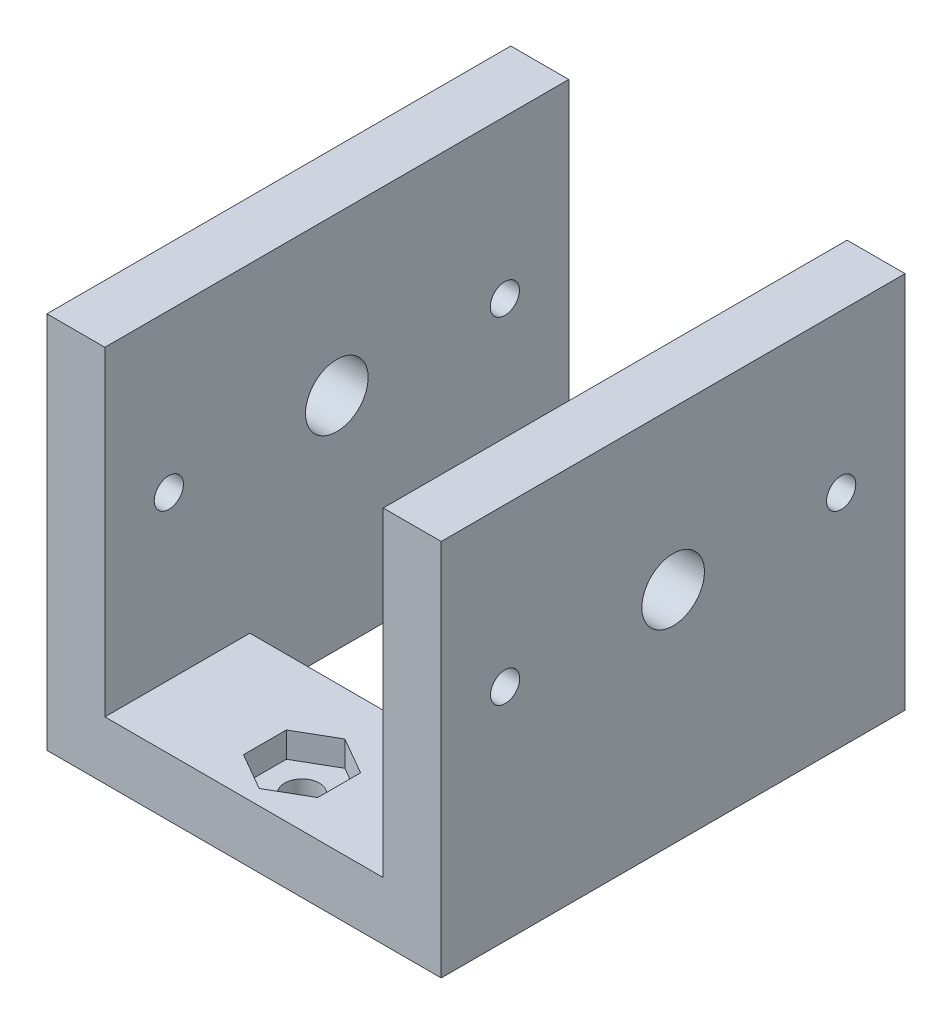
ISO-10303-21;
HEADER;
FILE_DESCRIPTION(('STEP AP214'),'2;1');
FILE_NAME('part.step','',(''),(''),'','','');
FILE_SCHEMA(('AUTOMOTIVE_DESIGN { 1 0 10303 214 1 1 1 1 }'));
ENDSEC;
DATA;
#1=APPLICATION_CONTEXT('core data for automotive mechanical design processes');
#2=APPLICATION_PROTOCOL_DEFINITION('international standard','automotive_design',2000,#1);
#3=PRODUCT_CONTEXT('',#1,'mechanical');
#4=PRODUCT('Part','Part','',(#3));
#5=PRODUCT_RELATED_PRODUCT_CATEGORY('part','',(#4));
#6=PRODUCT_DEFINITION_FORMATION('','',#4);
#7=PRODUCT_DEFINITION_CONTEXT('part definition',#1,'design');
#8=PRODUCT_DEFINITION('design','',#6,#7);
#9=PRODUCT_DEFINITION_SHAPE('','',#8);
#10=(LENGTH_UNIT() NAMED_UNIT(*) SI_UNIT(.MILLI.,.METRE.));
#11=(NAMED_UNIT(*) PLANE_ANGLE_UNIT() SI_UNIT($,.RADIAN.));
#12=(NAMED_UNIT(*) SI_UNIT($,.STERADIAN.) SOLID_ANGLE_UNIT());
#13=UNCERTAINTY_MEASURE_WITH_UNIT(LENGTH_MEASURE(1.E-05),#10,'distance_accuracy_value','');
#14=(GEOMETRIC_REPRESENTATION_CONTEXT(3) GLOBAL_UNCERTAINTY_ASSIGNED_CONTEXT((#13)) GLOBAL_UNIT_ASSIGNED_CONTEXT((#10,
#11,#12)) REPRESENTATION_CONTEXT('',''));
#15=CARTESIAN_POINT('',(0.,0.,0.));
#16=DIRECTION('',(0.,0.,1.));
#17=DIRECTION('',(1.,0.,0.));
#18=AXIS2_PLACEMENT_3D('',#15,#16,#17);
#19=CARTESIAN_POINT('',(-15.24,4.6822316367925,-12.7));
#20=DIRECTION('',(0.,-1.,0.));
#21=DIRECTION('',(0.,0.,-1.));
#22=AXIS2_PLACEMENT_3D('',#19,#20,#21);
#23=PLANE('',#22);
#24=DIRECTION('',(0.,0.,1.));
#25=VECTOR('',#24,1.);
#26=CARTESIAN_POINT('',(15.24,4.6822316367925,-12.7));
#27=LINE('',#26,#25);
#28=CARTESIAN_POINT('',(15.24,4.68223163679251,9.525));
#29=VERTEX_POINT('',#28);
#30=CARTESIAN_POINT('',(15.24,4.6822316367925,25.4));
#31=VERTEX_POINT('',#30);
#32=EDGE_CURVE('E317',#29,#31,#27,.T.);
#33=ORIENTED_EDGE('',*,*,#32,.F.);
#34=DIRECTION('',(-1.,0.,0.));
#35=VECTOR('',#34,1.);
#36=CARTESIAN_POINT('',(-15.24,4.6822316367925,9.525));
#37=LINE('',#36,#35);
#38=CARTESIAN_POINT('',(-15.24,4.6822316367925,9.525));
#39=VERTEX_POINT('',#38);
#40=EDGE_CURVE('E226',#29,#39,#37,.T.);
#41=ORIENTED_EDGE('',*,*,#40,.T.);
#42=DIRECTION('',(0.,0.,1.));
#43=VECTOR('',#42,1.);
#44=CARTESIAN_POINT('',(-15.24,4.6822316367925,-12.7));
#45=LINE('',#44,#43);
#46=CARTESIAN_POINT('',(-15.24,4.6822316367925,25.4));
#47=VERTEX_POINT('',#46);
#48=EDGE_CURVE('E322',#39,#47,#45,.T.);
#49=ORIENTED_EDGE('',*,*,#48,.T.);
#50=DIRECTION('',(-1.,0.,0.));
#51=VECTOR('',#50,1.);
#52=CARTESIAN_POINT('',(15.24,4.6822316367925,25.4));
#53=LINE('',#52,#51);
#54=EDGE_CURVE('E305',#31,#47,#53,.T.);
#55=ORIENTED_EDGE('',*,*,#54,.F.);
#56=EDGE_LOOP('',(#33,#41,#49,#55));
#57=FACE_BOUND('',#56,.T.);
#58=DIRECTION('',(0.,0.,1.));
#59=VECTOR('',#58,1.);
#60=CARTESIAN_POINT('',(4.064,4.6822316367925,16.7036485060134));
#61=LINE('',#60,#59);
#62=CARTESIAN_POINT('',(4.064,4.6822316367925,16.7036485060134));
#63=VERTEX_POINT('',#62);
#64=CARTESIAN_POINT('',(4.064,4.6822316367925,21.3963514939866));
#65=VERTEX_POINT('',#64);
#66=EDGE_CURVE('E65',#63,#65,#61,.T.);
#67=ORIENTED_EDGE('',*,*,#66,.T.);
#68=DIRECTION('',(-0.866025403784438,0.,0.5));
#69=VECTOR('',#68,1.);
#70=CARTESIAN_POINT('',(4.064,4.6822316367925,21.3963514939866));
#71=LINE('',#70,#69);
#72=CARTESIAN_POINT('',(0.,4.6822316367925,23.7427029879733));
#73=VERTEX_POINT('',#72);
#74=EDGE_CURVE('E400',#65,#73,#71,.T.);
#75=ORIENTED_EDGE('',*,*,#74,.T.);
#76=DIRECTION('',(-0.866025403784438,0.,-0.5));
#77=VECTOR('',#76,1.);
#78=CARTESIAN_POINT('',(0.,4.6822316367925,23.7427029879733));
#79=LINE('',#78,#77);
#80=CARTESIAN_POINT('',(-4.064,4.6822316367925,21.3963514939866));
#81=VERTEX_POINT('',#80);
#82=EDGE_CURVE('E424',#73,#81,#79,.T.);
#83=ORIENTED_EDGE('',*,*,#82,.T.);
#84=DIRECTION('',(0.,0.,-1.));
#85=VECTOR('',#84,1.);
#86=CARTESIAN_POINT('',(-4.064,4.6822316367925,21.3963514939866));
#87=LINE('',#86,#85);
#88=CARTESIAN_POINT('',(-4.064,4.6822316367925,16.7036485060134));
#89=VERTEX_POINT('',#88);
#90=EDGE_CURVE('E420',#81,#89,#87,.T.);
#91=ORIENTED_EDGE('',*,*,#90,.T.);
#92=DIRECTION('',(0.866025403784438,0.,-0.5));
#93=VECTOR('',#92,1.);
#94=CARTESIAN_POINT('',(-4.064,4.6822316367925,16.7036485060134));
#95=LINE('',#94,#93);
#96=CARTESIAN_POINT('',(0.,4.6822316367925,14.3572970120267));
#97=VERTEX_POINT('',#96);
#98=EDGE_CURVE('E409',#89,#97,#95,.T.);
#99=ORIENTED_EDGE('',*,*,#98,.T.);
#100=DIRECTION('',(0.866025403784438,0.,0.5));
#101=VECTOR('',#100,1.);
#102=CARTESIAN_POINT('',(0.,4.6822316367925,14.3572970120267));
#103=LINE('',#102,#101);
#104=EDGE_CURVE('E403',#97,#63,#103,.T.);
#105=ORIENTED_EDGE('',*,*,#104,.T.);
#106=EDGE_LOOP('',(#67,#75,#83,#91,#99,#105));
#107=FACE_BOUND('',#106,.T.);
#108=ADVANCED_FACE('F39',(#57,#107),#23,.F.);
#109=DIRECTION('',(-0.866025403784438,0.,-0.5));
#110=VECTOR('',#109,1.);
#111=CARTESIAN_POINT('',(4.064,4.6822316367925,-21.3963514939866));
#112=LINE('',#111,#110);
#113=CARTESIAN_POINT('',(4.064,4.6822316367925,-21.3963514939866));
#114=VERTEX_POINT('',#113);
#115=CARTESIAN_POINT('',(0.,4.6822316367925,-23.7427029879733));
#116=VERTEX_POINT('',#115);
#117=EDGE_CURVE('E477',#114,#116,#112,.T.);
#118=ORIENTED_EDGE('',*,*,#117,.F.);
#119=DIRECTION('',(0.,0.,-1.));
#120=VECTOR('',#119,1.);
#121=CARTESIAN_POINT('',(4.064,4.6822316367925,-16.7036485060134));
#122=LINE('',#121,#120);
#123=CARTESIAN_POINT('',(4.064,4.6822316367925,-16.7036485060134));
#124=VERTEX_POINT('',#123);
#125=EDGE_CURVE('E433',#124,#114,#122,.T.);
#126=ORIENTED_EDGE('',*,*,#125,.F.);
#127=DIRECTION('',(0.866025403784438,0.,-0.5));
#128=VECTOR('',#127,1.);
#129=CARTESIAN_POINT('',(0.,4.6822316367925,-14.3572970120267));
#130=LINE('',#129,#128);
#131=CARTESIAN_POINT('',(0.,4.6822316367925,-14.3572970120267));
#132=VERTEX_POINT('',#131);
#133=EDGE_CURVE('E454',#132,#124,#130,.T.);
#134=ORIENTED_EDGE('',*,*,#133,.F.);
#135=DIRECTION('',(0.866025403784438,0.,0.5));
#136=VECTOR('',#135,1.);
#137=CARTESIAN_POINT('',(-4.064,4.6822316367925,-16.7036485060134));
#138=LINE('',#137,#136);
#139=CARTESIAN_POINT('',(-4.064,4.6822316367925,-16.7036485060134));
#140=VERTEX_POINT('',#139);
#141=EDGE_CURVE('E489',#140,#132,#138,.T.);
#142=ORIENTED_EDGE('',*,*,#141,.F.);
#143=DIRECTION('',(0.,0.,1.));
#144=VECTOR('',#143,1.);
#145=CARTESIAN_POINT('',(-4.064,4.6822316367925,-21.3963514939866));
#146=LINE('',#145,#144);
#147=CARTESIAN_POINT('',(-4.064,4.6822316367925,-21.3963514939866));
#148=VERTEX_POINT('',#147);
#149=EDGE_CURVE('E485',#148,#140,#146,.T.);
#150=ORIENTED_EDGE('',*,*,#149,.F.);
#151=DIRECTION('',(-0.866025403784438,0.,0.5));
#152=VECTOR('',#151,1.);
#153=CARTESIAN_POINT('',(0.,4.6822316367925,-23.7427029879733));
#154=LINE('',#153,#152);
#155=EDGE_CURVE('E481',#116,#148,#154,.T.);
#156=ORIENTED_EDGE('',*,*,#155,.F.);
#157=EDGE_LOOP('',(#118,#126,#134,#142,#150,#156));
#158=FACE_BOUND('',#157,.T.);
#159=CARTESIAN_POINT('',(-15.24,4.6822316367925,-25.4));
#160=VERTEX_POINT('',#159);
#161=CARTESIAN_POINT('',(-15.24,4.68223163679251,-9.525));
#162=VERTEX_POINT('',#161);
#163=EDGE_CURVE('E318',#160,#162,#45,.T.);
#164=ORIENTED_EDGE('',*,*,#163,.T.);
#165=DIRECTION('',(1.,0.,0.));
#166=VECTOR('',#165,1.);
#167=CARTESIAN_POINT('',(-15.24,4.6822316367925,-9.525));
#168=LINE('',#167,#166);
#169=CARTESIAN_POINT('',(15.24,4.68223163679251,-9.525));
#170=VERTEX_POINT('',#169);
#171=EDGE_CURVE('E242',#162,#170,#168,.T.);
#172=ORIENTED_EDGE('',*,*,#171,.T.);
#173=CARTESIAN_POINT('',(15.24,4.6822316367925,-25.4));
#174=VERTEX_POINT('',#173);
#175=EDGE_CURVE('E314',#174,#170,#27,.T.);
#176=ORIENTED_EDGE('',*,*,#175,.F.);
#177=DIRECTION('',(-1.,0.,0.));
#178=VECTOR('',#177,1.);
#179=CARTESIAN_POINT('',(15.24,4.6822316367925,-25.4));
#180=LINE('',#179,#178);
#181=EDGE_CURVE('E274',#174,#160,#180,.T.);
#182=ORIENTED_EDGE('',*,*,#181,.T.);
#183=EDGE_LOOP('',(#164,#172,#176,#182));
#184=FACE_BOUND('',#183,.T.);
#185=ADVANCED_FACE('F361',(#158,#184),#23,.F.);
#186=CARTESIAN_POINT('',(-26.9407683632074,39.7342316367925,-12.7));
#187=DIRECTION('',(0.,1.,0.));
#188=DIRECTION('',(0.,0.,1.));
#189=AXIS2_PLACEMENT_3D('',#186,#187,#188);
#190=PLANE('',#189);
#191=DIRECTION('',(-1.,0.,0.));
#192=VECTOR('',#191,1.);
#193=CARTESIAN_POINT('',(26.9407683632074,39.7342316367925,25.4));
#194=LINE('',#193,#192);
#195=CARTESIAN_POINT('',(21.59,39.7342316367925,25.4));
#196=VERTEX_POINT('',#195);
#197=CARTESIAN_POINT('',(15.24,39.7342316367925,25.4));
#198=VERTEX_POINT('',#197);
#199=EDGE_CURVE('E297',#196,#198,#194,.T.);
#200=ORIENTED_EDGE('',*,*,#199,.F.);
#201=DIRECTION('',(0.,0.,1.));
#202=VECTOR('',#201,1.);
#203=CARTESIAN_POINT('',(21.59,39.7342316367925,-25.4));
#204=LINE('',#203,#202);
#205=CARTESIAN_POINT('',(21.59,39.7342316367925,-25.4));
#206=VERTEX_POINT('',#205);
#207=EDGE_CURVE('E250',#206,#196,#204,.T.);
#208=ORIENTED_EDGE('',*,*,#207,.F.);
#209=DIRECTION('',(-1.,0.,0.));
#210=VECTOR('',#209,1.);
#211=CARTESIAN_POINT('',(26.9407683632074,39.7342316367925,-25.4));
#212=LINE('',#211,#210);
#213=CARTESIAN_POINT('',(15.24,39.7342316367925,-25.4));
#214=VERTEX_POINT('',#213);
#215=EDGE_CURVE('E282',#206,#214,#212,.T.);
#216=ORIENTED_EDGE('',*,*,#215,.T.);
#217=DIRECTION('',(0.,0.,1.));
#218=VECTOR('',#217,1.);
#219=CARTESIAN_POINT('',(15.24,39.7342316367925,-12.7));
#220=LINE('',#219,#218);
#221=EDGE_CURVE('E313',#214,#198,#220,.T.);
#222=ORIENTED_EDGE('',*,*,#221,.T.);
#223=EDGE_LOOP('',(#200,#208,#216,#222));
#224=FACE_BOUND('',#223,.T.);
#225=ADVANCED_FACE('F372',(#224),#190,.T.);
#226=CARTESIAN_POINT('',(0.,0.,25.4));
#227=DIRECTION('',(0.,0.,1.));
#228=DIRECTION('',(1.,0.,0.));
#229=AXIS2_PLACEMENT_3D('',#226,#227,#228);
#230=PLANE('',#229);
#231=DIRECTION('',(1.,0.,0.));
#232=VECTOR('',#231,1.);
#233=CARTESIAN_POINT('',(-26.9407683632074,-1.66776836320751,25.4));
#234=LINE('',#233,#232);
#235=CARTESIAN_POINT('',(-21.59,-1.66776836320751,25.4));
#236=VERTEX_POINT('',#235);
#237=CARTESIAN_POINT('',(21.59,-1.66776836320751,25.4));
#238=VERTEX_POINT('',#237);
#239=EDGE_CURVE('E293',#236,#238,#234,.T.);
#240=ORIENTED_EDGE('',*,*,#239,.T.);
#241=DIRECTION('',(0.,1.,0.));
#242=VECTOR('',#241,1.);
#243=CARTESIAN_POINT('',(21.59,39.7342316367925,25.4));
#244=LINE('',#243,#242);
#245=EDGE_CURVE('E246',#238,#196,#244,.T.);
#246=ORIENTED_EDGE('',*,*,#245,.T.);
#247=ORIENTED_EDGE('',*,*,#199,.T.);
#248=DIRECTION('',(0.,-1.,0.));
#249=VECTOR('',#248,1.);
#250=CARTESIAN_POINT('',(15.24,39.7342316367925,25.4));
#251=LINE('',#250,#249);
#252=EDGE_CURVE('E301',#198,#31,#251,.T.);
#253=ORIENTED_EDGE('',*,*,#252,.T.);
#254=ORIENTED_EDGE('',*,*,#54,.T.);
#255=DIRECTION('',(0.,1.,0.));
#256=VECTOR('',#255,1.);
#257=CARTESIAN_POINT('',(-15.24,4.6822316367925,25.4));
#258=LINE('',#257,#256);
#259=CARTESIAN_POINT('',(-15.24,39.7342316367925,25.4));
#260=VERTEX_POINT('',#259);
#261=EDGE_CURVE('E309',#47,#260,#258,.T.);
#262=ORIENTED_EDGE('',*,*,#261,.T.);
#263=DIRECTION('',(-1.,0.,0.));
#264=VECTOR('',#263,1.);
#265=CARTESIAN_POINT('',(-15.24,39.7342316367925,25.4));
#266=LINE('',#265,#264);
#267=CARTESIAN_POINT('',(-21.59,39.7342316367925,25.4));
#268=VERTEX_POINT('',#267);
#269=EDGE_CURVE('E289',#260,#268,#266,.T.);
#270=ORIENTED_EDGE('',*,*,#269,.T.);
#271=DIRECTION('',(0.,1.,0.));
#272=VECTOR('',#271,1.);
#273=CARTESIAN_POINT('',(-21.59,39.7342316367925,25.4));
#274=LINE('',#273,#272);
#275=EDGE_CURVE('E256',#236,#268,#274,.T.);
#276=ORIENTED_EDGE('',*,*,#275,.F.);
#277=EDGE_LOOP('',(#240,#246,#247,#253,#254,#262,#270,#276));
#278=FACE_BOUND('',#277,.T.);
#279=ADVANCED_FACE('F375',(#278),#230,.T.);
#280=CARTESIAN_POINT('',(-26.9407683632074,-1.66776836320751,-25.4));
#281=DIRECTION('',(0.,-1.,0.));
#282=DIRECTION('',(0.,0.,-1.));
#283=AXIS2_PLACEMENT_3D('',#280,#281,#282);
#284=PLANE('',#283);
#285=CARTESIAN_POINT('',(0.,-1.66776836320751,-19.05));
#286=DIRECTION('',(0.,-1.,0.));
#287=DIRECTION('',(0.,0.,-1.));
#288=AXIS2_PLACEMENT_3D('',#285,#286,#287);
#289=CIRCLE('',#288,1.89864999999999);
#290=CARTESIAN_POINT('',(0.,-1.66776836320751,-20.94865));
#291=VERTEX_POINT('',#290);
#292=EDGE_CURVE('E405',#291,#291,#289,.T.);
#293=ORIENTED_EDGE('',*,*,#292,.F.);
#294=EDGE_LOOP('',(#293));
#295=FACE_BOUND('',#294,.T.);
#296=DIRECTION('',(1.,0.,0.));
#297=VECTOR('',#296,1.);
#298=CARTESIAN_POINT('',(-26.9407683632074,-1.66776836320751,-25.4));
#299=LINE('',#298,#297);
#300=CARTESIAN_POINT('',(-21.59,-1.66776836320751,-25.4));
#301=VERTEX_POINT('',#300);
#302=CARTESIAN_POINT('',(21.59,-1.66776836320751,-25.4));
#303=VERTEX_POINT('',#302);
#304=EDGE_CURVE('E285',#301,#303,#299,.T.);
#305=ORIENTED_EDGE('',*,*,#304,.T.);
#306=DIRECTION('',(0.,0.,-1.));
#307=VECTOR('',#306,1.);
#308=CARTESIAN_POINT('',(21.59,-1.66776836320751,25.4));
#309=LINE('',#308,#307);
#310=EDGE_CURVE('E253',#238,#303,#309,.T.);
#311=ORIENTED_EDGE('',*,*,#310,.F.);
#312=ORIENTED_EDGE('',*,*,#239,.F.);
#313=DIRECTION('',(0.,0.,-1.));
#314=VECTOR('',#313,1.);
#315=CARTESIAN_POINT('',(-21.59,-1.66776836320751,25.4));
#316=LINE('',#315,#314);
#317=EDGE_CURVE('E263',#236,#301,#316,.T.);
#318=ORIENTED_EDGE('',*,*,#317,.T.);
#319=EDGE_LOOP('',(#305,#311,#312,#318));
#320=FACE_BOUND('',#319,.T.);
#321=DIRECTION('',(0.,0.,-1.));
#322=VECTOR('',#321,1.);
#323=CARTESIAN_POINT('',(-15.24,-1.66776836320751,-12.7));
#324=LINE('',#323,#322);
#325=CARTESIAN_POINT('',(-15.24,-1.66776836320749,9.525));
#326=VERTEX_POINT('',#325);
#327=CARTESIAN_POINT('',(-15.24,-1.66776836320751,-9.525));
#328=VERTEX_POINT('',#327);
#329=EDGE_CURVE('E57',#326,#328,#324,.T.);
#330=ORIENTED_EDGE('',*,*,#329,.F.);
#331=DIRECTION('',(-1.,0.,0.));
#332=VECTOR('',#331,1.);
#333=CARTESIAN_POINT('',(-15.24,-1.66776836320751,9.525));
#334=LINE('',#333,#332);
#335=CARTESIAN_POINT('',(15.24,-1.66776836320751,9.525));
#336=VERTEX_POINT('',#335);
#337=EDGE_CURVE('E202',#336,#326,#334,.T.);
#338=ORIENTED_EDGE('',*,*,#337,.F.);
#339=DIRECTION('',(0.,0.,1.));
#340=VECTOR('',#339,1.);
#341=CARTESIAN_POINT('',(15.24,-1.66776836320751,-12.7));
#342=LINE('',#341,#340);
#343=CARTESIAN_POINT('',(15.24,-1.66776836320751,-9.525));
#344=VERTEX_POINT('',#343);
#345=EDGE_CURVE('E206',#344,#336,#342,.T.);
#346=ORIENTED_EDGE('',*,*,#345,.F.);
#347=DIRECTION('',(1.,0.,0.));
#348=VECTOR('',#347,1.);
#349=CARTESIAN_POINT('',(-15.24,-1.66776836320751,-9.525));
#350=LINE('',#349,#348);
#351=EDGE_CURVE('E222',#328,#344,#350,.T.);
#352=ORIENTED_EDGE('',*,*,#351,.F.);
#353=EDGE_LOOP('',(#330,#338,#346,#352));
#354=FACE_BOUND('',#353,.T.);
#355=CARTESIAN_POINT('',(0.,-1.66776836320751,19.05));
#356=DIRECTION('',(0.,1.,0.));
#357=DIRECTION('',(0.,0.,1.));
#358=AXIS2_PLACEMENT_3D('',#355,#356,#357);
#359=CIRCLE('',#358,1.89864999999999);
#360=CARTESIAN_POINT('',(0.,-1.66776836320751,20.94865));
#361=VERTEX_POINT('',#360);
#362=EDGE_CURVE('E671',#361,#361,#359,.T.);
#363=ORIENTED_EDGE('',*,*,#362,.T.);
#364=EDGE_LOOP('',(#363));
#365=FACE_BOUND('',#364,.T.);
#366=ADVANCED_FACE('F204',(#295,#320,#354,#365),#284,.T.);
#367=CARTESIAN_POINT('',(0.,0.,-25.4));
#368=DIRECTION('',(0.,0.,-1.));
#369=DIRECTION('',(1.,0.,0.));
#370=AXIS2_PLACEMENT_3D('',#367,#368,#369);
#371=PLANE('',#370);
#372=ORIENTED_EDGE('',*,*,#215,.F.);
#373=DIRECTION('',(0.,-1.,0.));
#374=VECTOR('',#373,1.);
#375=CARTESIAN_POINT('',(21.59,0.,-25.4));
#376=LINE('',#375,#374);
#377=EDGE_CURVE('E11',#206,#303,#376,.T.);
#378=ORIENTED_EDGE('',*,*,#377,.T.);
#379=ORIENTED_EDGE('',*,*,#304,.F.);
#380=DIRECTION('',(0.,-1.,0.));
#381=VECTOR('',#380,1.);
#382=CARTESIAN_POINT('',(-21.59,0.,-25.4));
#383=LINE('',#382,#381);
#384=CARTESIAN_POINT('',(-21.59,39.7342316367925,-25.4));
#385=VERTEX_POINT('',#384);
#386=EDGE_CURVE('E49',#385,#301,#383,.T.);
#387=ORIENTED_EDGE('',*,*,#386,.F.);
#388=DIRECTION('',(-1.,0.,0.));
#389=VECTOR('',#388,1.);
#390=CARTESIAN_POINT('',(-15.24,39.7342316367925,-25.4));
#391=LINE('',#390,#389);
#392=CARTESIAN_POINT('',(-15.24,39.7342316367925,-25.4));
#393=VERTEX_POINT('',#392);
#394=EDGE_CURVE('E266',#393,#385,#391,.T.);
#395=ORIENTED_EDGE('',*,*,#394,.F.);
#396=DIRECTION('',(0.,1.,0.));
#397=VECTOR('',#396,1.);
#398=CARTESIAN_POINT('',(-15.24,4.6822316367925,-25.4));
#399=LINE('',#398,#397);
#400=EDGE_CURVE('E270',#160,#393,#399,.T.);
#401=ORIENTED_EDGE('',*,*,#400,.F.);
#402=ORIENTED_EDGE('',*,*,#181,.F.);
#403=DIRECTION('',(0.,-1.,0.));
#404=VECTOR('',#403,1.);
#405=CARTESIAN_POINT('',(15.24,39.7342316367925,-25.4));
#406=LINE('',#405,#404);
#407=EDGE_CURVE('E278',#214,#174,#406,.T.);
#408=ORIENTED_EDGE('',*,*,#407,.F.);
#409=EDGE_LOOP('',(#372,#378,#379,#387,#395,#401,#402,#408));
#410=FACE_BOUND('',#409,.T.);
#411=ADVANCED_FACE('F366',(#410),#371,.T.);
#412=DIRECTION('',(0.,0.,1.));
#413=VECTOR('',#412,1.);
#414=CARTESIAN_POINT('',(-21.59,39.7342316367925,-25.4));
#415=LINE('',#414,#413);
#416=EDGE_CURVE('E259',#385,#268,#415,.T.);
#417=ORIENTED_EDGE('',*,*,#416,.T.);
#418=ORIENTED_EDGE('',*,*,#269,.F.);
#419=DIRECTION('',(0.,0.,1.));
#420=VECTOR('',#419,1.);
#421=CARTESIAN_POINT('',(-15.24,39.7342316367925,-12.7));
#422=LINE('',#421,#420);
#423=EDGE_CURVE('E323',#393,#260,#422,.T.);
#424=ORIENTED_EDGE('',*,*,#423,.F.);
#425=ORIENTED_EDGE('',*,*,#394,.T.);
#426=EDGE_LOOP('',(#417,#418,#424,#425));
#427=FACE_BOUND('',#426,.T.);
#428=ADVANCED_FACE('F41',(#427),#190,.T.);
#429=CARTESIAN_POINT('',(15.24,39.7342316367925,-12.7));
#430=DIRECTION('',(1.,0.,0.));
#431=DIRECTION('',(0.,1.,0.));
#432=AXIS2_PLACEMENT_3D('',#429,#430,#431);
#433=PLANE('',#432);
#434=CARTESIAN_POINT('',(15.24,22.4622316367925,0.));
#435=DIRECTION('',(1.,0.,0.));
#436=DIRECTION('',(0.,1.,0.));
#437=AXIS2_PLACEMENT_3D('',#434,#435,#436);
#438=CIRCLE('',#437,3.429);
#439=CARTESIAN_POINT('',(15.24,25.8912316367925,0.));
#440=VERTEX_POINT('',#439);
#441=EDGE_CURVE('E526',#440,#440,#438,.T.);
#442=ORIENTED_EDGE('',*,*,#441,.T.);
#443=EDGE_LOOP('',(#442));
#444=FACE_BOUND('',#443,.T.);
#445=CARTESIAN_POINT('',(15.24,22.4622316367925,18.4));
#446=DIRECTION('',(1.,0.,0.));
#447=DIRECTION('',(0.,1.,0.));
#448=AXIS2_PLACEMENT_3D('',#445,#446,#447);
#449=CIRCLE('',#448,1.6);
#450=CARTESIAN_POINT('',(15.24,24.0622316367925,18.4));
#451=VERTEX_POINT('',#450);
#452=EDGE_CURVE('E341',#451,#451,#449,.F.);
#453=ORIENTED_EDGE('',*,*,#452,.F.);
#454=EDGE_LOOP('',(#453));
#455=FACE_BOUND('',#454,.T.);
#456=CARTESIAN_POINT('',(15.24,22.4622316367925,-18.4));
#457=DIRECTION('',(1.,0.,0.));
#458=DIRECTION('',(0.,1.,0.));
#459=AXIS2_PLACEMENT_3D('',#456,#457,#458);
#460=CIRCLE('',#459,1.6);
#461=CARTESIAN_POINT('',(15.24,24.0622316367925,-18.4));
#462=VERTEX_POINT('',#461);
#463=EDGE_CURVE('E229',#462,#462,#460,.T.);
#464=ORIENTED_EDGE('',*,*,#463,.T.);
#465=EDGE_LOOP('',(#464));
#466=FACE_BOUND('',#465,.T.);
#467=DIRECTION('',(0.,-1.,0.));
#468=VECTOR('',#467,1.);
#469=CARTESIAN_POINT('',(15.24,39.7342316367925,-9.525));
#470=LINE('',#469,#468);
#471=EDGE_CURVE('E220',#170,#344,#470,.T.);
#472=ORIENTED_EDGE('',*,*,#471,.T.);
#473=ORIENTED_EDGE('',*,*,#345,.T.);
#474=DIRECTION('',(0.,-1.,0.));
#475=VECTOR('',#474,1.);
#476=CARTESIAN_POINT('',(15.24,39.7342316367925,9.525));
#477=LINE('',#476,#475);
#478=EDGE_CURVE('E217',#29,#336,#477,.T.);
#479=ORIENTED_EDGE('',*,*,#478,.F.);
#480=ORIENTED_EDGE('',*,*,#32,.T.);
#481=ORIENTED_EDGE('',*,*,#252,.F.);
#482=ORIENTED_EDGE('',*,*,#221,.F.);
#483=ORIENTED_EDGE('',*,*,#407,.T.);
#484=ORIENTED_EDGE('',*,*,#175,.T.);
#485=EDGE_LOOP('',(#472,#473,#479,#480,#481,#482,#483,#484));
#486=FACE_BOUND('',#485,.T.);
#487=ADVANCED_FACE('F216',(#444,#455,#466,#486),#433,.F.);
#488=CARTESIAN_POINT('',(-15.24,39.7342316367925,-12.7));
#489=DIRECTION('',(-1.,0.,0.));
#490=DIRECTION('',(0.,-1.,0.));
#491=AXIS2_PLACEMENT_3D('',#488,#489,#490);
#492=PLANE('',#491);
#493=CARTESIAN_POINT('',(-15.24,22.4622316367925,0.));
#494=DIRECTION('',(-1.,0.,0.));
#495=DIRECTION('',(0.,-1.,0.));
#496=AXIS2_PLACEMENT_3D('',#493,#494,#495);
#497=CIRCLE('',#496,3.429);
#498=CARTESIAN_POINT('',(-15.24,19.0332316367925,0.));
#499=VERTEX_POINT('',#498);
#500=EDGE_CURVE('E522',#499,#499,#497,.T.);
#501=ORIENTED_EDGE('',*,*,#500,.T.);
#502=EDGE_LOOP('',(#501));
#503=FACE_BOUND('',#502,.T.);
#504=CARTESIAN_POINT('',(-15.24,22.4622316367925,18.4));
#505=DIRECTION('',(-1.,0.,0.));
#506=DIRECTION('',(0.,-1.,0.));
#507=AXIS2_PLACEMENT_3D('',#504,#505,#506);
#508=CIRCLE('',#507,1.6);
#509=CARTESIAN_POINT('',(-15.24,20.8622316367925,18.4));
#510=VERTEX_POINT('',#509);
#511=EDGE_CURVE('E347',#510,#510,#508,.F.);
#512=ORIENTED_EDGE('',*,*,#511,.F.);
#513=EDGE_LOOP('',(#512));
#514=FACE_BOUND('',#513,.T.);
#515=CARTESIAN_POINT('',(-15.24,22.4622316367925,-18.4));
#516=DIRECTION('',(-1.,0.,0.));
#517=DIRECTION('',(0.,-1.,0.));
#518=AXIS2_PLACEMENT_3D('',#515,#516,#517);
#519=CIRCLE('',#518,1.6);
#520=CARTESIAN_POINT('',(-15.24,20.8622316367925,-18.4));
#521=VERTEX_POINT('',#520);
#522=EDGE_CURVE('E236',#521,#521,#519,.T.);
#523=ORIENTED_EDGE('',*,*,#522,.T.);
#524=EDGE_LOOP('',(#523));
#525=FACE_BOUND('',#524,.T.);
#526=DIRECTION('',(0.,-1.,0.));
#527=VECTOR('',#526,1.);
#528=CARTESIAN_POINT('',(-15.24,39.7342316367925,9.525));
#529=LINE('',#528,#527);
#530=EDGE_CURVE('E228',#39,#326,#529,.T.);
#531=ORIENTED_EDGE('',*,*,#530,.T.);
#532=ORIENTED_EDGE('',*,*,#329,.T.);
#533=DIRECTION('',(0.,-1.,0.));
#534=VECTOR('',#533,1.);
#535=CARTESIAN_POINT('',(-15.24,39.7342316367925,-9.525));
#536=LINE('',#535,#534);
#537=EDGE_CURVE('E233',#162,#328,#536,.T.);
#538=ORIENTED_EDGE('',*,*,#537,.F.);
#539=ORIENTED_EDGE('',*,*,#163,.F.);
#540=ORIENTED_EDGE('',*,*,#400,.T.);
#541=ORIENTED_EDGE('',*,*,#423,.T.);
#542=ORIENTED_EDGE('',*,*,#261,.F.);
#543=ORIENTED_EDGE('',*,*,#48,.F.);
#544=EDGE_LOOP('',(#531,#532,#538,#539,#540,#541,#542,#543));
#545=FACE_BOUND('',#544,.T.);
#546=ADVANCED_FACE('F358',(#503,#514,#525,#545),#492,.F.);
#547=CARTESIAN_POINT('',(-21.59,39.7342316367925,-25.4));
#548=DIRECTION('',(1.,0.,0.));
#549=DIRECTION('',(0.,1.,0.));
#550=AXIS2_PLACEMENT_3D('',#547,#548,#549);
#551=PLANE('',#550);
#552=CARTESIAN_POINT('',(-21.59,22.4622316367925,0.));
#553=DIRECTION('',(1.,0.,0.));
#554=DIRECTION('',(0.,1.,0.));
#555=AXIS2_PLACEMENT_3D('',#552,#553,#554);
#556=CIRCLE('',#555,3.429);
#557=CARTESIAN_POINT('',(-21.59,25.8912316367925,0.));
#558=VERTEX_POINT('',#557);
#559=EDGE_CURVE('E518',#558,#558,#556,.T.);
#560=ORIENTED_EDGE('',*,*,#559,.T.);
#561=EDGE_LOOP('',(#560));
#562=FACE_BOUND('',#561,.T.);
#563=CARTESIAN_POINT('',(-21.59,22.4622316367925,18.4));
#564=DIRECTION('',(1.,0.,0.));
#565=DIRECTION('',(0.,-1.,0.));
#566=AXIS2_PLACEMENT_3D('',#563,#564,#565);
#567=CIRCLE('',#566,1.6);
#568=CARTESIAN_POINT('',(-21.59,20.8622316367925,18.4));
#569=VERTEX_POINT('',#568);
#570=EDGE_CURVE('E530',#569,#569,#567,.T.);
#571=ORIENTED_EDGE('',*,*,#570,.T.);
#572=EDGE_LOOP('',(#571));
#573=FACE_BOUND('',#572,.T.);
#574=CARTESIAN_POINT('',(-21.59,22.4622316367925,-18.4));
#575=DIRECTION('',(-1.,0.,0.));
#576=DIRECTION('',(0.,-1.,0.));
#577=AXIS2_PLACEMENT_3D('',#574,#575,#576);
#578=CIRCLE('',#577,1.6);
#579=CARTESIAN_POINT('',(-21.59,20.8622316367925,-18.4));
#580=VERTEX_POINT('',#579);
#581=EDGE_CURVE('E333',#580,#580,#578,.T.);
#582=ORIENTED_EDGE('',*,*,#581,.F.);
#583=EDGE_LOOP('',(#582));
#584=FACE_BOUND('',#583,.T.);
#585=ORIENTED_EDGE('',*,*,#386,.T.);
#586=ORIENTED_EDGE('',*,*,#317,.F.);
#587=ORIENTED_EDGE('',*,*,#275,.T.);
#588=ORIENTED_EDGE('',*,*,#416,.F.);
#589=EDGE_LOOP('',(#585,#586,#587,#588));
#590=FACE_BOUND('',#589,.T.);
#591=ADVANCED_FACE('F570',(#562,#573,#584,#590),#551,.F.);
#592=CARTESIAN_POINT('',(21.59,39.7342316367925,-25.4));
#593=DIRECTION('',(1.,0.,0.));
#594=DIRECTION('',(0.,1.,0.));
#595=AXIS2_PLACEMENT_3D('',#592,#593,#594);
#596=PLANE('',#595);
#597=ORIENTED_EDGE('',*,*,#310,.T.);
#598=ORIENTED_EDGE('',*,*,#377,.F.);
#599=ORIENTED_EDGE('',*,*,#207,.T.);
#600=ORIENTED_EDGE('',*,*,#245,.F.);
#601=EDGE_LOOP('',(#597,#598,#599,#600));
#602=FACE_BOUND('',#601,.T.);
#603=CARTESIAN_POINT('',(21.59,22.4622316367925,0.));
#604=DIRECTION('',(1.,0.,0.));
#605=DIRECTION('',(0.,1.,0.));
#606=AXIS2_PLACEMENT_3D('',#603,#604,#605);
#607=CIRCLE('',#606,3.429);
#608=CARTESIAN_POINT('',(21.59,25.8912316367925,0.));
#609=VERTEX_POINT('',#608);
#610=EDGE_CURVE('E499',#609,#609,#607,.T.);
#611=ORIENTED_EDGE('',*,*,#610,.F.);
#612=EDGE_LOOP('',(#611));
#613=FACE_BOUND('',#612,.T.);
#614=CARTESIAN_POINT('',(21.59,22.4622316367925,18.4));
#615=DIRECTION('',(1.,0.,0.));
#616=DIRECTION('',(0.,1.,0.));
#617=AXIS2_PLACEMENT_3D('',#614,#615,#616);
#618=CIRCLE('',#617,1.6);
#619=CARTESIAN_POINT('',(21.59,24.0622316367925,18.4));
#620=VERTEX_POINT('',#619);
#621=EDGE_CURVE('E43',#620,#620,#618,.F.);
#622=ORIENTED_EDGE('',*,*,#621,.T.);
#623=EDGE_LOOP('',(#622));
#624=FACE_BOUND('',#623,.T.);
#625=CARTESIAN_POINT('',(21.59,22.4622316367925,-18.4));
#626=DIRECTION('',(1.,0.,0.));
#627=DIRECTION('',(0.,1.,0.));
#628=AXIS2_PLACEMENT_3D('',#625,#626,#627);
#629=CIRCLE('',#628,1.6);
#630=CARTESIAN_POINT('',(21.59,24.0622316367925,-18.4));
#631=VERTEX_POINT('',#630);
#632=EDGE_CURVE('E330',#631,#631,#629,.T.);
#633=ORIENTED_EDGE('',*,*,#632,.F.);
#634=EDGE_LOOP('',(#633));
#635=FACE_BOUND('',#634,.T.);
#636=ADVANCED_FACE('F381',(#602,#613,#624,#635),#596,.T.);
#637=CARTESIAN_POINT('',(-15.24,39.7342316367925,-9.525));
#638=DIRECTION('',(0.,0.,-1.));
#639=DIRECTION('',(-1.,0.,0.));
#640=AXIS2_PLACEMENT_3D('',#637,#638,#639);
#641=PLANE('',#640);
#642=ORIENTED_EDGE('',*,*,#537,.T.);
#643=ORIENTED_EDGE('',*,*,#351,.T.);
#644=ORIENTED_EDGE('',*,*,#471,.F.);
#645=ORIENTED_EDGE('',*,*,#171,.F.);
#646=EDGE_LOOP('',(#642,#643,#644,#645));
#647=FACE_BOUND('',#646,.T.);
#648=ADVANCED_FACE('F356',(#647),#641,.F.);
#649=CARTESIAN_POINT('',(-15.24,39.7342316367925,9.525));
#650=DIRECTION('',(0.,0.,1.));
#651=DIRECTION('',(1.,0.,0.));
#652=AXIS2_PLACEMENT_3D('',#649,#650,#651);
#653=PLANE('',#652);
#654=ORIENTED_EDGE('',*,*,#478,.T.);
#655=ORIENTED_EDGE('',*,*,#337,.T.);
#656=ORIENTED_EDGE('',*,*,#530,.F.);
#657=ORIENTED_EDGE('',*,*,#40,.F.);
#658=EDGE_LOOP('',(#654,#655,#656,#657));
#659=FACE_BOUND('',#658,.T.);
#660=ADVANCED_FACE('F224',(#659),#653,.F.);
#661=CARTESIAN_POINT('',(36.4657683632074,22.4622316367925,-18.4));
#662=DIRECTION('',(-1.,0.,0.));
#663=DIRECTION('',(0.,-1.,0.));
#664=AXIS2_PLACEMENT_3D('',#661,#662,#663);
#665=CYLINDRICAL_SURFACE('',#664,1.6);
#666=ORIENTED_EDGE('',*,*,#632,.T.);
#667=EDGE_LOOP('',(#666));
#668=FACE_BOUND('',#667,.T.);
#669=ORIENTED_EDGE('',*,*,#463,.F.);
#670=EDGE_LOOP('',(#669));
#671=FACE_BOUND('',#670,.T.);
#672=ADVANCED_FACE('F556',(#668,#671),#665,.F.);
#673=ORIENTED_EDGE('',*,*,#581,.T.);
#674=EDGE_LOOP('',(#673));
#675=FACE_BOUND('',#674,.T.);
#676=ORIENTED_EDGE('',*,*,#522,.F.);
#677=EDGE_LOOP('',(#676));
#678=FACE_BOUND('',#677,.T.);
#679=ADVANCED_FACE('F547',(#675,#678),#665,.F.);
#680=CARTESIAN_POINT('',(36.4657683632074,22.4622316367925,18.4));
#681=DIRECTION('',(-1.,0.,0.));
#682=DIRECTION('',(0.,-1.,0.));
#683=AXIS2_PLACEMENT_3D('',#680,#681,#682);
#684=CYLINDRICAL_SURFACE('',#683,1.6);
#685=ORIENTED_EDGE('',*,*,#621,.F.);
#686=EDGE_LOOP('',(#685));
#687=FACE_BOUND('',#686,.T.);
#688=ORIENTED_EDGE('',*,*,#452,.T.);
#689=EDGE_LOOP('',(#688));
#690=FACE_BOUND('',#689,.T.);
#691=ADVANCED_FACE('F543',(#687,#690),#684,.F.);
#692=ORIENTED_EDGE('',*,*,#570,.F.);
#693=EDGE_LOOP('',(#692));
#694=FACE_BOUND('',#693,.T.);
#695=ORIENTED_EDGE('',*,*,#511,.T.);
#696=EDGE_LOOP('',(#695));
#697=FACE_BOUND('',#696,.T.);
#698=ADVANCED_FACE('F546',(#694,#697),#684,.F.);
#699=CARTESIAN_POINT('',(-36.4657683632074,22.4622316367925,0.));
#700=DIRECTION('',(1.,0.,0.));
#701=DIRECTION('',(0.,1.,0.));
#702=AXIS2_PLACEMENT_3D('',#699,#700,#701);
#703=CYLINDRICAL_SURFACE('',#702,3.429);
#704=ORIENTED_EDGE('',*,*,#610,.T.);
#705=EDGE_LOOP('',(#704));
#706=FACE_BOUND('',#705,.T.);
#707=ORIENTED_EDGE('',*,*,#441,.F.);
#708=EDGE_LOOP('',(#707));
#709=FACE_BOUND('',#708,.T.);
#710=ADVANCED_FACE('F594',(#706,#709),#703,.F.);
#711=ORIENTED_EDGE('',*,*,#559,.F.);
#712=EDGE_LOOP('',(#711));
#713=FACE_BOUND('',#712,.T.);
#714=ORIENTED_EDGE('',*,*,#500,.F.);
#715=EDGE_LOOP('',(#714));
#716=FACE_BOUND('',#715,.T.);
#717=ADVANCED_FACE('F591',(#713,#716),#703,.F.);
#718=CARTESIAN_POINT('',(4.064,1.9041066367925,-16.7036485060134));
#719=DIRECTION('',(1.,0.,0.));
#720=DIRECTION('',(0.,0.,-1.));
#721=AXIS2_PLACEMENT_3D('',#718,#719,#720);
#722=PLANE('',#721);
#723=ORIENTED_EDGE('',*,*,#125,.T.);
#724=DIRECTION('',(0.,1.,0.));
#725=VECTOR('',#724,1.);
#726=CARTESIAN_POINT('',(4.064,1.9041066367925,-21.3963514939866));
#727=LINE('',#726,#725);
#728=CARTESIAN_POINT('',(4.064,1.9041066367925,-21.3963514939866));
#729=VERTEX_POINT('',#728);
#730=EDGE_CURVE('E474',#729,#114,#727,.T.);
#731=ORIENTED_EDGE('',*,*,#730,.F.);
#732=DIRECTION('',(0.,0.,-1.));
#733=VECTOR('',#732,1.);
#734=CARTESIAN_POINT('',(4.064,1.9041066367925,-16.7036485060134));
#735=LINE('',#734,#733);
#736=CARTESIAN_POINT('',(4.064,1.9041066367925,-16.7036485060134));
#737=VERTEX_POINT('',#736);
#738=EDGE_CURVE('E449',#737,#729,#735,.T.);
#739=ORIENTED_EDGE('',*,*,#738,.F.);
#740=DIRECTION('',(0.,1.,0.));
#741=VECTOR('',#740,1.);
#742=CARTESIAN_POINT('',(4.064,1.9041066367925,-16.7036485060134));
#743=LINE('',#742,#741);
#744=EDGE_CURVE('E496',#737,#124,#743,.T.);
#745=ORIENTED_EDGE('',*,*,#744,.T.);
#746=EDGE_LOOP('',(#723,#731,#739,#745));
#747=FACE_BOUND('',#746,.T.);
#748=ADVANCED_FACE('F593',(#747),#722,.F.);
#749=CARTESIAN_POINT('',(0.,1.9041066367925,-14.3572970120267));
#750=DIRECTION('',(0.5,0.,0.866025403784439));
#751=DIRECTION('',(0.866025403784439,0.,-0.5));
#752=AXIS2_PLACEMENT_3D('',#749,#750,#751);
#753=PLANE('',#752);
#754=ORIENTED_EDGE('',*,*,#133,.T.);
#755=ORIENTED_EDGE('',*,*,#744,.F.);
#756=DIRECTION('',(0.866025403784438,0.,-0.5));
#757=VECTOR('',#756,1.);
#758=CARTESIAN_POINT('',(0.,1.9041066367925,-14.3572970120267));
#759=LINE('',#758,#757);
#760=CARTESIAN_POINT('',(0.,1.9041066367925,-14.3572970120267));
#761=VERTEX_POINT('',#760);
#762=EDGE_CURVE('E470',#761,#737,#759,.T.);
#763=ORIENTED_EDGE('',*,*,#762,.F.);
#764=DIRECTION('',(0.,1.,0.));
#765=VECTOR('',#764,1.);
#766=CARTESIAN_POINT('',(0.,1.9041066367925,-14.3572970120267));
#767=LINE('',#766,#765);
#768=EDGE_CURVE('E500',#761,#132,#767,.T.);
#769=ORIENTED_EDGE('',*,*,#768,.T.);
#770=EDGE_LOOP('',(#754,#755,#763,#769));
#771=FACE_BOUND('',#770,.T.);
#772=ADVANCED_FACE('F600',(#771),#753,.F.);
#773=CARTESIAN_POINT('',(-4.064,1.9041066367925,-16.7036485060134));
#774=DIRECTION('',(-0.5,0.,0.866025403784439));
#775=DIRECTION('',(0.866025403784439,0.,0.5));
#776=AXIS2_PLACEMENT_3D('',#773,#774,#775);
#777=PLANE('',#776);
#778=ORIENTED_EDGE('',*,*,#141,.T.);
#779=ORIENTED_EDGE('',*,*,#768,.F.);
#780=DIRECTION('',(0.866025403784438,0.,0.5));
#781=VECTOR('',#780,1.);
#782=CARTESIAN_POINT('',(-4.064,1.9041066367925,-16.7036485060134));
#783=LINE('',#782,#781);
#784=CARTESIAN_POINT('',(-4.064,1.9041066367925,-16.7036485060134));
#785=VERTEX_POINT('',#784);
#786=EDGE_CURVE('E466',#785,#761,#783,.T.);
#787=ORIENTED_EDGE('',*,*,#786,.F.);
#788=DIRECTION('',(0.,1.,0.));
#789=VECTOR('',#788,1.);
#790=CARTESIAN_POINT('',(-4.064,1.9041066367925,-16.7036485060134));
#791=LINE('',#790,#789);
#792=EDGE_CURVE('E503',#785,#140,#791,.T.);
#793=ORIENTED_EDGE('',*,*,#792,.T.);
#794=EDGE_LOOP('',(#778,#779,#787,#793));
#795=FACE_BOUND('',#794,.T.);
#796=ADVANCED_FACE('F618',(#795),#777,.F.);
#797=CARTESIAN_POINT('',(-4.064,1.9041066367925,-21.3963514939866));
#798=DIRECTION('',(-1.,0.,0.));
#799=DIRECTION('',(0.,0.,1.));
#800=AXIS2_PLACEMENT_3D('',#797,#798,#799);
#801=PLANE('',#800);
#802=ORIENTED_EDGE('',*,*,#149,.T.);
#803=ORIENTED_EDGE('',*,*,#792,.F.);
#804=DIRECTION('',(0.,0.,1.));
#805=VECTOR('',#804,1.);
#806=CARTESIAN_POINT('',(-4.064,1.9041066367925,-21.3963514939866));
#807=LINE('',#806,#805);
#808=CARTESIAN_POINT('',(-4.064,1.9041066367925,-21.3963514939866));
#809=VERTEX_POINT('',#808);
#810=EDGE_CURVE('E462',#809,#785,#807,.T.);
#811=ORIENTED_EDGE('',*,*,#810,.F.);
#812=DIRECTION('',(0.,1.,0.));
#813=VECTOR('',#812,1.);
#814=CARTESIAN_POINT('',(-4.064,1.9041066367925,-21.3963514939866));
#815=LINE('',#814,#813);
#816=EDGE_CURVE('E506',#809,#148,#815,.T.);
#817=ORIENTED_EDGE('',*,*,#816,.T.);
#818=EDGE_LOOP('',(#802,#803,#811,#817));
#819=FACE_BOUND('',#818,.T.);
#820=ADVANCED_FACE('F614',(#819),#801,.F.);
#821=CARTESIAN_POINT('',(0.,1.9041066367925,-23.7427029879733));
#822=DIRECTION('',(-0.5,0.,-0.866025403784439));
#823=DIRECTION('',(-0.866025403784439,0.,0.5));
#824=AXIS2_PLACEMENT_3D('',#821,#822,#823);
#825=PLANE('',#824);
#826=ORIENTED_EDGE('',*,*,#155,.T.);
#827=ORIENTED_EDGE('',*,*,#816,.F.);
#828=DIRECTION('',(-0.866025403784438,0.,0.5));
#829=VECTOR('',#828,1.);
#830=CARTESIAN_POINT('',(0.,1.9041066367925,-23.7427029879733));
#831=LINE('',#830,#829);
#832=CARTESIAN_POINT('',(0.,1.9041066367925,-23.7427029879733));
#833=VERTEX_POINT('',#832);
#834=EDGE_CURVE('E458',#833,#809,#831,.T.);
#835=ORIENTED_EDGE('',*,*,#834,.F.);
#836=DIRECTION('',(0.,1.,0.));
#837=VECTOR('',#836,1.);
#838=CARTESIAN_POINT('',(0.,1.9041066367925,-23.7427029879733));
#839=LINE('',#838,#837);
#840=EDGE_CURVE('E509',#833,#116,#839,.T.);
#841=ORIENTED_EDGE('',*,*,#840,.T.);
#842=EDGE_LOOP('',(#826,#827,#835,#841));
#843=FACE_BOUND('',#842,.T.);
#844=ADVANCED_FACE('F610',(#843),#825,.F.);
#845=CARTESIAN_POINT('',(4.064,1.9041066367925,-21.3963514939866));
#846=DIRECTION('',(0.5,0.,-0.866025403784439));
#847=DIRECTION('',(-0.866025403784439,0.,-0.5));
#848=AXIS2_PLACEMENT_3D('',#845,#846,#847);
#849=PLANE('',#848);
#850=ORIENTED_EDGE('',*,*,#117,.T.);
#851=ORIENTED_EDGE('',*,*,#840,.F.);
#852=DIRECTION('',(-0.866025403784438,0.,-0.5));
#853=VECTOR('',#852,1.);
#854=CARTESIAN_POINT('',(4.064,1.9041066367925,-21.3963514939866));
#855=LINE('',#854,#853);
#856=EDGE_CURVE('E453',#729,#833,#855,.T.);
#857=ORIENTED_EDGE('',*,*,#856,.F.);
#858=ORIENTED_EDGE('',*,*,#730,.T.);
#859=EDGE_LOOP('',(#850,#851,#857,#858));
#860=FACE_BOUND('',#859,.T.);
#861=ADVANCED_FACE('F606',(#860),#849,.F.);
#862=CARTESIAN_POINT('',(0.,1.9041066367925,0.));
#863=DIRECTION('',(0.,1.,0.));
#864=DIRECTION('',(0.,0.,1.));
#865=AXIS2_PLACEMENT_3D('',#862,#863,#864);
#866=PLANE('',#865);
#867=CARTESIAN_POINT('',(0.,1.9041066367925,-19.05));
#868=DIRECTION('',(0.,1.,0.));
#869=DIRECTION('',(0.,0.,1.));
#870=AXIS2_PLACEMENT_3D('',#867,#868,#869);
#871=CIRCLE('',#870,1.89864999999999);
#872=CARTESIAN_POINT('',(0.,1.9041066367925,-17.15135));
#873=VERTEX_POINT('',#872);
#874=EDGE_CURVE('E412',#873,#873,#871,.T.);
#875=ORIENTED_EDGE('',*,*,#874,.F.);
#876=EDGE_LOOP('',(#875));
#877=FACE_BOUND('',#876,.T.);
#878=ORIENTED_EDGE('',*,*,#738,.T.);
#879=ORIENTED_EDGE('',*,*,#856,.T.);
#880=ORIENTED_EDGE('',*,*,#834,.T.);
#881=ORIENTED_EDGE('',*,*,#810,.T.);
#882=ORIENTED_EDGE('',*,*,#786,.T.);
#883=ORIENTED_EDGE('',*,*,#762,.T.);
#884=EDGE_LOOP('',(#878,#879,#880,#881,#882,#883));
#885=FACE_BOUND('',#884,.T.);
#886=ADVANCED_FACE('F609',(#877,#885),#866,.T.);
#887=CARTESIAN_POINT('',(4.064,1.9041066367925,16.7036485060134));
#888=DIRECTION('',(-1.,0.,0.));
#889=DIRECTION('',(0.,0.,1.));
#890=AXIS2_PLACEMENT_3D('',#887,#888,#889);
#891=PLANE('',#890);
#892=ORIENTED_EDGE('',*,*,#66,.F.);
#893=DIRECTION('',(0.,1.,0.));
#894=VECTOR('',#893,1.);
#895=CARTESIAN_POINT('',(4.064,1.9041066367925,16.7036485060134));
#896=LINE('',#895,#894);
#897=CARTESIAN_POINT('',(4.064,1.9041066367925,16.7036485060134));
#898=VERTEX_POINT('',#897);
#899=EDGE_CURVE('E446',#898,#63,#896,.T.);
#900=ORIENTED_EDGE('',*,*,#899,.F.);
#901=DIRECTION('',(0.,0.,1.));
#902=VECTOR('',#901,1.);
#903=CARTESIAN_POINT('',(4.064,1.9041066367925,16.7036485060134));
#904=LINE('',#903,#902);
#905=CARTESIAN_POINT('',(4.064,1.9041066367925,21.3963514939866));
#906=VERTEX_POINT('',#905);
#907=EDGE_CURVE('E429',#898,#906,#904,.T.);
#908=ORIENTED_EDGE('',*,*,#907,.T.);
#909=DIRECTION('',(0.,1.,0.));
#910=VECTOR('',#909,1.);
#911=CARTESIAN_POINT('',(4.064,1.9041066367925,21.3963514939866));
#912=LINE('',#911,#910);
#913=EDGE_CURVE('E430',#906,#65,#912,.T.);
#914=ORIENTED_EDGE('',*,*,#913,.T.);
#915=EDGE_LOOP('',(#892,#900,#908,#914));
#916=FACE_BOUND('',#915,.T.);
#917=ADVANCED_FACE('F628',(#916),#891,.T.);
#918=CARTESIAN_POINT('',(4.064,1.9041066367925,21.3963514939866));
#919=DIRECTION('',(-0.5,0.,-0.866025403784439));
#920=DIRECTION('',(-0.866025403784439,0.,0.5));
#921=AXIS2_PLACEMENT_3D('',#918,#919,#920);
#922=PLANE('',#921);
#923=ORIENTED_EDGE('',*,*,#74,.F.);
#924=ORIENTED_EDGE('',*,*,#913,.F.);
#925=DIRECTION('',(-0.866025403784438,0.,0.5));
#926=VECTOR('',#925,1.);
#927=CARTESIAN_POINT('',(4.064,1.9041066367925,21.3963514939866));
#928=LINE('',#927,#926);
#929=CARTESIAN_POINT('',(0.,1.9041066367925,23.7427029879733));
#930=VERTEX_POINT('',#929);
#931=EDGE_CURVE('E415',#906,#930,#928,.T.);
#932=ORIENTED_EDGE('',*,*,#931,.T.);
#933=DIRECTION('',(0.,1.,0.));
#934=VECTOR('',#933,1.);
#935=CARTESIAN_POINT('',(0.,1.9041066367925,23.7427029879733));
#936=LINE('',#935,#934);
#937=EDGE_CURVE('E434',#930,#73,#936,.T.);
#938=ORIENTED_EDGE('',*,*,#937,.T.);
#939=EDGE_LOOP('',(#923,#924,#932,#938));
#940=FACE_BOUND('',#939,.T.);
#941=ADVANCED_FACE('F632',(#940),#922,.T.);
#942=CARTESIAN_POINT('',(0.,1.9041066367925,23.7427029879733));
#943=DIRECTION('',(0.5,0.,-0.866025403784439));
#944=DIRECTION('',(-0.866025403784439,0.,-0.5));
#945=AXIS2_PLACEMENT_3D('',#942,#943,#944);
#946=PLANE('',#945);
#947=ORIENTED_EDGE('',*,*,#82,.F.);
#948=ORIENTED_EDGE('',*,*,#937,.F.);
#949=DIRECTION('',(-0.866025403784438,0.,-0.5));
#950=VECTOR('',#949,1.);
#951=CARTESIAN_POINT('',(0.,1.9041066367925,23.7427029879733));
#952=LINE('',#951,#950);
#953=CARTESIAN_POINT('',(-4.064,1.9041066367925,21.3963514939866));
#954=VERTEX_POINT('',#953);
#955=EDGE_CURVE('E692',#930,#954,#952,.T.);
#956=ORIENTED_EDGE('',*,*,#955,.T.);
#957=DIRECTION('',(0.,1.,0.));
#958=VECTOR('',#957,1.);
#959=CARTESIAN_POINT('',(-4.064,1.9041066367925,21.3963514939866));
#960=LINE('',#959,#958);
#961=EDGE_CURVE('E437',#954,#81,#960,.T.);
#962=ORIENTED_EDGE('',*,*,#961,.T.);
#963=EDGE_LOOP('',(#947,#948,#956,#962));
#964=FACE_BOUND('',#963,.T.);
#965=ADVANCED_FACE('F645',(#964),#946,.T.);
#966=CARTESIAN_POINT('',(-4.064,1.9041066367925,21.3963514939866));
#967=DIRECTION('',(1.,0.,0.));
#968=DIRECTION('',(0.,0.,-1.));
#969=AXIS2_PLACEMENT_3D('',#966,#967,#968);
#970=PLANE('',#969);
#971=ORIENTED_EDGE('',*,*,#90,.F.);
#972=ORIENTED_EDGE('',*,*,#961,.F.);
#973=DIRECTION('',(0.,0.,-1.));
#974=VECTOR('',#973,1.);
#975=CARTESIAN_POINT('',(-4.064,1.9041066367925,21.3963514939866));
#976=LINE('',#975,#974);
#977=CARTESIAN_POINT('',(-4.064,1.9041066367925,16.7036485060134));
#978=VERTEX_POINT('',#977);
#979=EDGE_CURVE('E690',#954,#978,#976,.T.);
#980=ORIENTED_EDGE('',*,*,#979,.T.);
#981=DIRECTION('',(0.,1.,0.));
#982=VECTOR('',#981,1.);
#983=CARTESIAN_POINT('',(-4.064,1.9041066367925,16.7036485060134));
#984=LINE('',#983,#982);
#985=EDGE_CURVE('E440',#978,#89,#984,.T.);
#986=ORIENTED_EDGE('',*,*,#985,.T.);
#987=EDGE_LOOP('',(#971,#972,#980,#986));
#988=FACE_BOUND('',#987,.T.);
#989=ADVANCED_FACE('F641',(#988),#970,.T.);
#990=CARTESIAN_POINT('',(-4.064,1.9041066367925,16.7036485060134));
#991=DIRECTION('',(0.5,0.,0.866025403784439));
#992=DIRECTION('',(0.866025403784439,0.,-0.5));
#993=AXIS2_PLACEMENT_3D('',#990,#991,#992);
#994=PLANE('',#993);
#995=ORIENTED_EDGE('',*,*,#98,.F.);
#996=ORIENTED_EDGE('',*,*,#985,.F.);
#997=DIRECTION('',(0.866025403784438,0.,-0.5));
#998=VECTOR('',#997,1.);
#999=CARTESIAN_POINT('',(-4.064,1.9041066367925,16.7036485060134));
#1000=LINE('',#999,#998);
#1001=CARTESIAN_POINT('',(0.,1.9041066367925,14.3572970120267));
#1002=VERTEX_POINT('',#1001);
#1003=EDGE_CURVE('E687',#978,#1002,#1000,.T.);
#1004=ORIENTED_EDGE('',*,*,#1003,.T.);
#1005=DIRECTION('',(0.,1.,0.));
#1006=VECTOR('',#1005,1.);
#1007=CARTESIAN_POINT('',(0.,1.9041066367925,14.3572970120267));
#1008=LINE('',#1007,#1006);
#1009=EDGE_CURVE('E443',#1002,#97,#1008,.T.);
#1010=ORIENTED_EDGE('',*,*,#1009,.T.);
#1011=EDGE_LOOP('',(#995,#996,#1004,#1010));
#1012=FACE_BOUND('',#1011,.T.);
#1013=ADVANCED_FACE('F637',(#1012),#994,.T.);
#1014=CARTESIAN_POINT('',(0.,1.9041066367925,14.3572970120267));
#1015=DIRECTION('',(-0.5,0.,0.866025403784439));
#1016=DIRECTION('',(0.866025403784439,0.,0.5));
#1017=AXIS2_PLACEMENT_3D('',#1014,#1015,#1016);
#1018=PLANE('',#1017);
#1019=ORIENTED_EDGE('',*,*,#104,.F.);
#1020=ORIENTED_EDGE('',*,*,#1009,.F.);
#1021=DIRECTION('',(0.866025403784438,0.,0.5));
#1022=VECTOR('',#1021,1.);
#1023=CARTESIAN_POINT('',(0.,1.9041066367925,14.3572970120267));
#1024=LINE('',#1023,#1022);
#1025=EDGE_CURVE('E684',#1002,#898,#1024,.T.);
#1026=ORIENTED_EDGE('',*,*,#1025,.T.);
#1027=ORIENTED_EDGE('',*,*,#899,.T.);
#1028=EDGE_LOOP('',(#1019,#1020,#1026,#1027));
#1029=FACE_BOUND('',#1028,.T.);
#1030=ADVANCED_FACE('F633',(#1029),#1018,.T.);
#1031=CARTESIAN_POINT('',(0.,1.9041066367925,0.));
#1032=DIRECTION('',(0.,1.,0.));
#1033=DIRECTION('',(0.,0.,-1.));
#1034=AXIS2_PLACEMENT_3D('',#1031,#1032,#1033);
#1035=PLANE('',#1034);
#1036=CARTESIAN_POINT('',(0.,1.9041066367925,19.05));
#1037=DIRECTION('',(0.,1.,0.));
#1038=DIRECTION('',(0.,0.,1.));
#1039=AXIS2_PLACEMENT_3D('',#1036,#1037,#1038);
#1040=CIRCLE('',#1039,1.89864999999999);
#1041=CARTESIAN_POINT('',(0.,1.9041066367925,20.94865));
#1042=VERTEX_POINT('',#1041);
#1043=EDGE_CURVE('E668',#1042,#1042,#1040,.T.);
#1044=ORIENTED_EDGE('',*,*,#1043,.F.);
#1045=EDGE_LOOP('',(#1044));
#1046=FACE_BOUND('',#1045,.T.);
#1047=ORIENTED_EDGE('',*,*,#907,.F.);
#1048=ORIENTED_EDGE('',*,*,#1025,.F.);
#1049=ORIENTED_EDGE('',*,*,#1003,.F.);
#1050=ORIENTED_EDGE('',*,*,#979,.F.);
#1051=ORIENTED_EDGE('',*,*,#955,.F.);
#1052=ORIENTED_EDGE('',*,*,#931,.F.);
#1053=EDGE_LOOP('',(#1047,#1048,#1049,#1050,#1051,#1052));
#1054=FACE_BOUND('',#1053,.T.);
#1055=ADVANCED_FACE('F636',(#1046,#1054),#1035,.T.);
#1056=CARTESIAN_POINT('',(0.,1.9041066367925,-19.05));
#1057=DIRECTION('',(0.,1.,0.));
#1058=DIRECTION('',(0.,0.,1.));
#1059=AXIS2_PLACEMENT_3D('',#1056,#1057,#1058);
#1060=CYLINDRICAL_SURFACE('',#1059,1.89864999999999);
#1061=ORIENTED_EDGE('',*,*,#292,.T.);
#1062=EDGE_LOOP('',(#1061));
#1063=FACE_BOUND('',#1062,.T.);
#1064=ORIENTED_EDGE('',*,*,#874,.T.);
#1065=EDGE_LOOP('',(#1064));
#1066=FACE_BOUND('',#1065,.T.);
#1067=ADVANCED_FACE('F655',(#1063,#1066),#1060,.F.);
#1068=CARTESIAN_POINT('',(0.,1.9041066367925,19.05));
#1069=DIRECTION('',(0.,1.,0.));
#1070=DIRECTION('',(0.,0.,1.));
#1071=AXIS2_PLACEMENT_3D('',#1068,#1069,#1070);
#1072=CYLINDRICAL_SURFACE('',#1071,1.89864999999999);
#1073=ORIENTED_EDGE('',*,*,#1043,.T.);
#1074=EDGE_LOOP('',(#1073));
#1075=FACE_BOUND('',#1074,.T.);
#1076=ORIENTED_EDGE('',*,*,#362,.F.);
#1077=EDGE_LOOP('',(#1076));
#1078=FACE_BOUND('',#1077,.T.);
#1079=ADVANCED_FACE('F659',(#1075,#1078),#1072,.F.);
#1080=CLOSED_SHELL('',(#108,#185,#225,#279,#366,#411,#428,#487,#546,#591,#636,#648,#660,#672,
#679,#691,#698,#710,#717,#748,#772,#796,#820,#844,#861,#886,#917,#941,#965,#989,#1013,#1030,
#1055,#1067,#1079));
#1081=MANIFOLD_SOLID_BREP('B2',#1080);
#1082=ADVANCED_BREP_SHAPE_REPRESENTATION('',(#18,#1081),#14);
#1083=SHAPE_DEFINITION_REPRESENTATION(#9,#1082);
ENDSEC;
END-ISO-10303-21;
